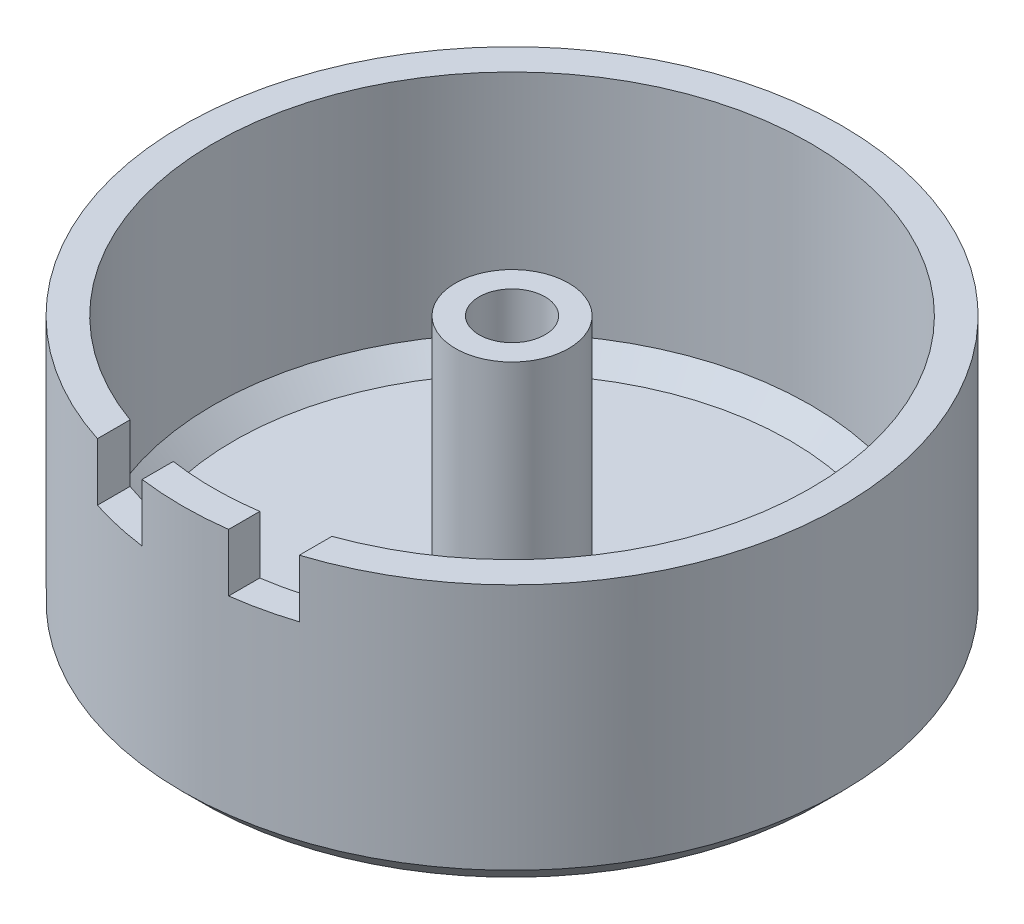
ISO-10303-21;
HEADER;
FILE_DESCRIPTION(('STEP AP214'),'2;1');
FILE_NAME('part.step','',(''),(''),'','','');
FILE_SCHEMA(('AUTOMOTIVE_DESIGN { 1 0 10303 214 1 1 1 1 }'));
ENDSEC;
DATA;
#1=APPLICATION_CONTEXT('core data for automotive mechanical design processes');
#2=APPLICATION_PROTOCOL_DEFINITION('international standard','automotive_design',2000,#1);
#3=PRODUCT_CONTEXT('',#1,'mechanical');
#4=PRODUCT('Part','Part','',(#3));
#5=PRODUCT_RELATED_PRODUCT_CATEGORY('part','',(#4));
#6=PRODUCT_DEFINITION_FORMATION('','',#4);
#7=PRODUCT_DEFINITION_CONTEXT('part definition',#1,'design');
#8=PRODUCT_DEFINITION('design','',#6,#7);
#9=PRODUCT_DEFINITION_SHAPE('','',#8);
#10=(LENGTH_UNIT() NAMED_UNIT(*) SI_UNIT(.MILLI.,.METRE.));
#11=(NAMED_UNIT(*) PLANE_ANGLE_UNIT() SI_UNIT($,.RADIAN.));
#12=(NAMED_UNIT(*) SI_UNIT($,.STERADIAN.) SOLID_ANGLE_UNIT());
#13=UNCERTAINTY_MEASURE_WITH_UNIT(LENGTH_MEASURE(1.E-05),#10,'distance_accuracy_value','');
#14=(GEOMETRIC_REPRESENTATION_CONTEXT(3) GLOBAL_UNCERTAINTY_ASSIGNED_CONTEXT((#13)) GLOBAL_UNIT_ASSIGNED_CONTEXT((#10,
#11,#12)) REPRESENTATION_CONTEXT('',''));
#15=CARTESIAN_POINT('',(0.,0.,0.));
#16=DIRECTION('',(0.,0.,1.));
#17=DIRECTION('',(1.,0.,0.));
#18=AXIS2_PLACEMENT_3D('',#15,#16,#17);
#19=CARTESIAN_POINT('',(-16.,6.25,0.));
#20=DIRECTION('',(0.,-1.,0.));
#21=DIRECTION('',(0.,0.,-1.));
#22=AXIS2_PLACEMENT_3D('',#19,#20,#21);
#23=PLANE('',#22);
#24=DIRECTION('',(0.,0.,-1.));
#25=VECTOR('',#24,1.);
#26=CARTESIAN_POINT('',(-4.9,6.25,20.));
#27=LINE('',#26,#25);
#28=CARTESIAN_POINT('',(-4.9,6.25,15.2312179421082));
#29=VERTEX_POINT('',#28);
#30=CARTESIAN_POINT('',(-4.9,6.25,13.6469776873856));
#31=VERTEX_POINT('',#30);
#32=EDGE_CURVE('E116',#29,#31,#27,.T.);
#33=ORIENTED_EDGE('',*,*,#32,.T.);
#34=CARTESIAN_POINT('',(0.,6.25,0.));
#35=DIRECTION('',(0.,-1.,0.));
#36=DIRECTION('',(0.,0.,-1.));
#37=AXIS2_PLACEMENT_3D('',#34,#35,#36);
#38=CIRCLE('',#37,14.5);
#39=CARTESIAN_POINT('',(4.9,6.25,13.6469776873856));
#40=VERTEX_POINT('',#39);
#41=EDGE_CURVE('E194',#31,#40,#38,.T.);
#42=ORIENTED_EDGE('',*,*,#41,.T.);
#43=DIRECTION('',(0.,0.,-1.));
#44=VECTOR('',#43,1.);
#45=CARTESIAN_POINT('',(4.9,6.25,20.));
#46=LINE('',#45,#44);
#47=CARTESIAN_POINT('',(4.9,6.25,15.2312179421082));
#48=VERTEX_POINT('',#47);
#49=EDGE_CURVE('E154',#48,#40,#46,.T.);
#50=ORIENTED_EDGE('',*,*,#49,.F.);
#51=CARTESIAN_POINT('',(0.,6.25,0.));
#52=DIRECTION('',(0.,-1.,0.));
#53=DIRECTION('',(0.,0.,-1.));
#54=AXIS2_PLACEMENT_3D('',#51,#52,#53);
#55=CIRCLE('',#54,16.);
#56=EDGE_CURVE('E122',#29,#48,#55,.T.);
#57=ORIENTED_EDGE('',*,*,#56,.F.);
#58=EDGE_LOOP('',(#33,#42,#50,#57));
#59=FACE_BOUND('',#58,.T.);
#60=ADVANCED_FACE('F37',(#59),#23,.F.);
#61=DIRECTION('',(0.,0.,-1.));
#62=VECTOR('',#61,1.);
#63=CARTESIAN_POINT('',(-2.1,6.25,20.));
#64=LINE('',#63,#62);
#65=CARTESIAN_POINT('',(-2.1,6.25,15.8615888233178));
#66=VERTEX_POINT('',#65);
#67=CARTESIAN_POINT('',(-2.1,6.25,14.3471251475688));
#68=VERTEX_POINT('',#67);
#69=EDGE_CURVE('E140',#66,#68,#64,.T.);
#70=ORIENTED_EDGE('',*,*,#69,.F.);
#71=CARTESIAN_POINT('',(2.1,6.25,15.8615888233178));
#72=VERTEX_POINT('',#71);
#73=EDGE_CURVE('E137',#72,#66,#55,.T.);
#74=ORIENTED_EDGE('',*,*,#73,.F.);
#75=DIRECTION('',(0.,0.,-1.));
#76=VECTOR('',#75,1.);
#77=CARTESIAN_POINT('',(2.1,6.25,20.));
#78=LINE('',#77,#76);
#79=CARTESIAN_POINT('',(2.1,6.25,14.3471251475688));
#80=VERTEX_POINT('',#79);
#81=EDGE_CURVE('E156',#72,#80,#78,.T.);
#82=ORIENTED_EDGE('',*,*,#81,.T.);
#83=EDGE_CURVE('E108',#80,#68,#38,.T.);
#84=ORIENTED_EDGE('',*,*,#83,.T.);
#85=EDGE_LOOP('',(#70,#74,#82,#84));
#86=FACE_BOUND('',#85,.T.);
#87=ADVANCED_FACE('F144',(#86),#23,.F.);
#88=CARTESIAN_POINT('',(0.,0.,0.));
#89=DIRECTION('',(0.,-1.,0.));
#90=DIRECTION('',(0.,0.,-1.));
#91=AXIS2_PLACEMENT_3D('',#88,#89,#90);
#92=CYLINDRICAL_SURFACE('',#91,14.5);
#93=CARTESIAN_POINT('',(0.,-4.75,0.));
#94=DIRECTION('',(0.,-1.,0.));
#95=DIRECTION('',(0.,0.,-1.));
#96=AXIS2_PLACEMENT_3D('',#93,#94,#95);
#97=CIRCLE('',#96,14.5);
#98=CARTESIAN_POINT('',(0.,-4.75,-14.5));
#99=VERTEX_POINT('',#98);
#100=EDGE_CURVE('E191',#99,#99,#97,.T.);
#101=ORIENTED_EDGE('',*,*,#100,.T.);
#102=EDGE_LOOP('',(#101));
#103=FACE_BOUND('',#102,.T.);
#104=DIRECTION('',(0.,-1.,0.));
#105=VECTOR('',#104,1.);
#106=CARTESIAN_POINT('',(-4.9,0.,13.6469776873856));
#107=LINE('',#106,#105);
#108=CARTESIAN_POINT('',(-4.9,3.45,13.6469776873856));
#109=VERTEX_POINT('',#108);
#110=EDGE_CURVE('E167',#109,#31,#107,.F.);
#111=ORIENTED_EDGE('',*,*,#110,.F.);
#112=CARTESIAN_POINT('',(0.,3.45,0.));
#113=DIRECTION('',(0.,1.,0.));
#114=DIRECTION('',(-1.,0.,0.));
#115=AXIS2_PLACEMENT_3D('',#112,#113,#114);
#116=CIRCLE('',#115,14.5);
#117=CARTESIAN_POINT('',(-2.1,3.45,14.3471251475688));
#118=VERTEX_POINT('',#117);
#119=EDGE_CURVE('E165',#118,#109,#116,.F.);
#120=ORIENTED_EDGE('',*,*,#119,.F.);
#121=DIRECTION('',(0.,-1.,0.));
#122=VECTOR('',#121,1.);
#123=CARTESIAN_POINT('',(-2.1,0.,14.3471251475688));
#124=LINE('',#123,#122);
#125=EDGE_CURVE('E163',#68,#118,#124,.T.);
#126=ORIENTED_EDGE('',*,*,#125,.F.);
#127=ORIENTED_EDGE('',*,*,#83,.F.);
#128=DIRECTION('',(0.,-1.,0.));
#129=VECTOR('',#128,1.);
#130=CARTESIAN_POINT('',(2.1,0.,14.3471251475688));
#131=LINE('',#130,#129);
#132=CARTESIAN_POINT('',(2.1,3.45,14.3471251475688));
#133=VERTEX_POINT('',#132);
#134=EDGE_CURVE('E160',#133,#80,#131,.F.);
#135=ORIENTED_EDGE('',*,*,#134,.F.);
#136=CARTESIAN_POINT('',(0.,3.45,0.));
#137=DIRECTION('',(0.,1.,0.));
#138=DIRECTION('',(-1.,0.,0.));
#139=AXIS2_PLACEMENT_3D('',#136,#137,#138);
#140=CIRCLE('',#139,14.5);
#141=CARTESIAN_POINT('',(4.9,3.45,13.6469776873856));
#142=VERTEX_POINT('',#141);
#143=EDGE_CURVE('E153',#142,#133,#140,.F.);
#144=ORIENTED_EDGE('',*,*,#143,.F.);
#145=DIRECTION('',(0.,-1.,0.));
#146=VECTOR('',#145,1.);
#147=CARTESIAN_POINT('',(4.9,0.,13.6469776873856));
#148=LINE('',#147,#146);
#149=EDGE_CURVE('E115',#40,#142,#148,.T.);
#150=ORIENTED_EDGE('',*,*,#149,.F.);
#151=ORIENTED_EDGE('',*,*,#41,.F.);
#152=EDGE_LOOP('',(#111,#120,#126,#127,#135,#144,#150,#151));
#153=FACE_BOUND('',#152,.T.);
#154=ADVANCED_FACE('F200',(#103,#153),#92,.F.);
#155=CARTESIAN_POINT('',(0.,0.,0.));
#156=DIRECTION('',(0.,-1.,0.));
#157=DIRECTION('',(0.,0.,-1.));
#158=AXIS2_PLACEMENT_3D('',#155,#156,#157);
#159=CYLINDRICAL_SURFACE('',#158,16.);
#160=CARTESIAN_POINT('',(0.,-5.75297943852697,0.));
#161=DIRECTION('',(0.,-1.,0.));
#162=DIRECTION('',(0.,0.,-1.));
#163=AXIS2_PLACEMENT_3D('',#160,#161,#162);
#164=CIRCLE('',#163,16.);
#165=CARTESIAN_POINT('',(0.,-5.75297943852697,-16.));
#166=VERTEX_POINT('',#165);
#167=EDGE_CURVE('E170',#166,#166,#164,.T.);
#168=ORIENTED_EDGE('',*,*,#167,.F.);
#169=EDGE_LOOP('',(#168));
#170=FACE_BOUND('',#169,.T.);
#171=DIRECTION('',(0.,-1.,0.));
#172=VECTOR('',#171,1.);
#173=CARTESIAN_POINT('',(-4.9,0.,15.2312179421082));
#174=LINE('',#173,#172);
#175=CARTESIAN_POINT('',(-4.9,3.45,15.2312179421082));
#176=VERTEX_POINT('',#175);
#177=EDGE_CURVE('E11',#29,#176,#174,.T.);
#178=ORIENTED_EDGE('',*,*,#177,.F.);
#179=ORIENTED_EDGE('',*,*,#56,.T.);
#180=DIRECTION('',(0.,-1.,0.));
#181=VECTOR('',#180,1.);
#182=CARTESIAN_POINT('',(4.9,0.,15.2312179421082));
#183=LINE('',#182,#181);
#184=CARTESIAN_POINT('',(4.9,3.45,15.2312179421082));
#185=VERTEX_POINT('',#184);
#186=EDGE_CURVE('E112',#185,#48,#183,.F.);
#187=ORIENTED_EDGE('',*,*,#186,.F.);
#188=CARTESIAN_POINT('',(0.,3.45,0.));
#189=DIRECTION('',(0.,1.,0.));
#190=DIRECTION('',(-1.,0.,0.));
#191=AXIS2_PLACEMENT_3D('',#188,#189,#190);
#192=CIRCLE('',#191,16.);
#193=CARTESIAN_POINT('',(2.1,3.45,15.8615888233178));
#194=VERTEX_POINT('',#193);
#195=EDGE_CURVE('E99',#194,#185,#192,.T.);
#196=ORIENTED_EDGE('',*,*,#195,.F.);
#197=DIRECTION('',(0.,-1.,0.));
#198=VECTOR('',#197,1.);
#199=CARTESIAN_POINT('',(2.1,0.,15.8615888233178));
#200=LINE('',#199,#198);
#201=EDGE_CURVE('E107',#72,#194,#200,.T.);
#202=ORIENTED_EDGE('',*,*,#201,.F.);
#203=ORIENTED_EDGE('',*,*,#73,.T.);
#204=DIRECTION('',(0.,-1.,0.));
#205=VECTOR('',#204,1.);
#206=CARTESIAN_POINT('',(-2.1,0.,15.8615888233178));
#207=LINE('',#206,#205);
#208=CARTESIAN_POINT('',(-2.1,3.45,15.8615888233178));
#209=VERTEX_POINT('',#208);
#210=EDGE_CURVE('E123',#209,#66,#207,.F.);
#211=ORIENTED_EDGE('',*,*,#210,.F.);
#212=CARTESIAN_POINT('',(0.,3.45,0.));
#213=DIRECTION('',(0.,1.,0.));
#214=DIRECTION('',(-1.,0.,0.));
#215=AXIS2_PLACEMENT_3D('',#212,#213,#214);
#216=CIRCLE('',#215,16.);
#217=EDGE_CURVE('E44',#176,#209,#216,.T.);
#218=ORIENTED_EDGE('',*,*,#217,.F.);
#219=EDGE_LOOP('',(#178,#179,#187,#196,#202,#203,#211,#218));
#220=FACE_BOUND('',#219,.T.);
#221=ADVANCED_FACE('F120',(#170,#220),#159,.T.);
#222=CARTESIAN_POINT('',(0.,-5.75,0.));
#223=DIRECTION('',(0.,1.,0.));
#224=DIRECTION('',(0.,0.,1.));
#225=AXIS2_PLACEMENT_3D('',#222,#223,#224);
#226=CONICAL_SURFACE('',#225,13.5,0.785398163397447);
#227=ORIENTED_EDGE('',*,*,#100,.F.);
#228=EDGE_LOOP('',(#227));
#229=FACE_BOUND('',#228,.T.);
#230=CARTESIAN_POINT('',(0.,-5.75,0.));
#231=DIRECTION('',(0.,-1.,0.));
#232=DIRECTION('',(0.,0.,-1.));
#233=AXIS2_PLACEMENT_3D('',#230,#231,#232);
#234=CIRCLE('',#233,13.5);
#235=CARTESIAN_POINT('',(0.,-5.75,-13.5));
#236=VERTEX_POINT('',#235);
#237=EDGE_CURVE('E188',#236,#236,#234,.T.);
#238=ORIENTED_EDGE('',*,*,#237,.T.);
#239=EDGE_LOOP('',(#238));
#240=FACE_BOUND('',#239,.T.);
#241=ADVANCED_FACE('F226',(#229,#240),#226,.F.);
#242=CARTESIAN_POINT('',(-13.5,-5.75,0.));
#243=DIRECTION('',(0.,-1.,0.));
#244=DIRECTION('',(0.,0.,-1.));
#245=AXIS2_PLACEMENT_3D('',#242,#243,#244);
#246=PLANE('',#245);
#247=ORIENTED_EDGE('',*,*,#237,.F.);
#248=EDGE_LOOP('',(#247));
#249=FACE_BOUND('',#248,.T.);
#250=CARTESIAN_POINT('',(0.,-5.75,0.));
#251=DIRECTION('',(0.,-1.,0.));
#252=DIRECTION('',(0.,0.,-1.));
#253=AXIS2_PLACEMENT_3D('',#250,#251,#252);
#254=CIRCLE('',#253,2.75);
#255=CARTESIAN_POINT('',(0.,-5.75,-2.75));
#256=VERTEX_POINT('',#255);
#257=EDGE_CURVE('E185',#256,#256,#254,.T.);
#258=ORIENTED_EDGE('',*,*,#257,.T.);
#259=EDGE_LOOP('',(#258));
#260=FACE_BOUND('',#259,.T.);
#261=ADVANCED_FACE('F232',(#249,#260),#246,.F.);
#262=CARTESIAN_POINT('',(0.,0.,0.));
#263=DIRECTION('',(0.,-1.,0.));
#264=DIRECTION('',(0.,0.,-1.));
#265=AXIS2_PLACEMENT_3D('',#262,#263,#264);
#266=CYLINDRICAL_SURFACE('',#265,2.75);
#267=ORIENTED_EDGE('',*,*,#257,.F.);
#268=EDGE_LOOP('',(#267));
#269=FACE_BOUND('',#268,.T.);
#270=CARTESIAN_POINT('',(0.,6.25,0.));
#271=DIRECTION('',(0.,-1.,0.));
#272=DIRECTION('',(0.,0.,-1.));
#273=AXIS2_PLACEMENT_3D('',#270,#271,#272);
#274=CIRCLE('',#273,2.75);
#275=CARTESIAN_POINT('',(0.,6.25,-2.75));
#276=VERTEX_POINT('',#275);
#277=EDGE_CURVE('E182',#276,#276,#274,.T.);
#278=ORIENTED_EDGE('',*,*,#277,.T.);
#279=EDGE_LOOP('',(#278));
#280=FACE_BOUND('',#279,.T.);
#281=ADVANCED_FACE('F236',(#269,#280),#266,.T.);
#282=CARTESIAN_POINT('',(-2.75,6.25,0.));
#283=DIRECTION('',(0.,-1.,0.));
#284=DIRECTION('',(0.,0.,-1.));
#285=AXIS2_PLACEMENT_3D('',#282,#283,#284);
#286=PLANE('',#285);
#287=ORIENTED_EDGE('',*,*,#277,.F.);
#288=EDGE_LOOP('',(#287));
#289=FACE_BOUND('',#288,.T.);
#290=CARTESIAN_POINT('',(0.,6.25,0.));
#291=DIRECTION('',(0.,-1.,0.));
#292=DIRECTION('',(0.,0.,-1.));
#293=AXIS2_PLACEMENT_3D('',#290,#291,#292);
#294=CIRCLE('',#293,1.6);
#295=CARTESIAN_POINT('',(0.,6.25,-1.6));
#296=VERTEX_POINT('',#295);
#297=EDGE_CURVE('E179',#296,#296,#294,.T.);
#298=ORIENTED_EDGE('',*,*,#297,.T.);
#299=EDGE_LOOP('',(#298));
#300=FACE_BOUND('',#299,.T.);
#301=ADVANCED_FACE('F240',(#289,#300),#286,.F.);
#302=CARTESIAN_POINT('',(0.,0.,0.));
#303=DIRECTION('',(0.,-1.,0.));
#304=DIRECTION('',(0.,0.,-1.));
#305=AXIS2_PLACEMENT_3D('',#302,#303,#304);
#306=CYLINDRICAL_SURFACE('',#305,1.6);
#307=ORIENTED_EDGE('',*,*,#297,.F.);
#308=EDGE_LOOP('',(#307));
#309=FACE_BOUND('',#308,.T.);
#310=CARTESIAN_POINT('',(0.,-6.75,0.));
#311=DIRECTION('',(0.,-1.,0.));
#312=DIRECTION('',(0.,0.,-1.));
#313=AXIS2_PLACEMENT_3D('',#310,#311,#312);
#314=CIRCLE('',#313,1.6);
#315=CARTESIAN_POINT('',(0.,-6.75,-1.6));
#316=VERTEX_POINT('',#315);
#317=EDGE_CURVE('E176',#316,#316,#314,.T.);
#318=ORIENTED_EDGE('',*,*,#317,.T.);
#319=EDGE_LOOP('',(#318));
#320=FACE_BOUND('',#319,.T.);
#321=ADVANCED_FACE('F244',(#309,#320),#306,.F.);
#322=CARTESIAN_POINT('',(-1.6,-6.75,0.));
#323=DIRECTION('',(0.,1.,0.));
#324=DIRECTION('',(0.,0.,1.));
#325=AXIS2_PLACEMENT_3D('',#322,#323,#324);
#326=PLANE('',#325);
#327=ORIENTED_EDGE('',*,*,#317,.F.);
#328=EDGE_LOOP('',(#327));
#329=FACE_BOUND('',#328,.T.);
#330=CARTESIAN_POINT('',(0.,-6.75,0.));
#331=DIRECTION('',(0.,-1.,0.));
#332=DIRECTION('',(0.,0.,-1.));
#333=AXIS2_PLACEMENT_3D('',#330,#331,#332);
#334=CIRCLE('',#333,15.002979438527);
#335=CARTESIAN_POINT('',(0.,-6.75,-15.002979438527));
#336=VERTEX_POINT('',#335);
#337=EDGE_CURVE('E173',#336,#336,#334,.T.);
#338=ORIENTED_EDGE('',*,*,#337,.T.);
#339=EDGE_LOOP('',(#338));
#340=FACE_BOUND('',#339,.T.);
#341=ADVANCED_FACE('F248',(#329,#340),#326,.F.);
#342=CARTESIAN_POINT('',(0.,-5.75297943852697,0.));
#343=DIRECTION('',(0.,1.,0.));
#344=DIRECTION('',(0.,0.,1.));
#345=AXIS2_PLACEMENT_3D('',#342,#343,#344);
#346=CONICAL_SURFACE('',#345,16.,0.785398163397447);
#347=ORIENTED_EDGE('',*,*,#337,.F.);
#348=EDGE_LOOP('',(#347));
#349=FACE_BOUND('',#348,.T.);
#350=ORIENTED_EDGE('',*,*,#167,.T.);
#351=EDGE_LOOP('',(#350));
#352=FACE_BOUND('',#351,.T.);
#353=ADVANCED_FACE('F252',(#349,#352),#346,.T.);
#354=CARTESIAN_POINT('',(4.9,6.25,20.));
#355=DIRECTION('',(-1.,0.,0.));
#356=DIRECTION('',(0.,-1.,0.));
#357=AXIS2_PLACEMENT_3D('',#354,#355,#356);
#358=PLANE('',#357);
#359=ORIENTED_EDGE('',*,*,#149,.T.);
#360=DIRECTION('',(0.,0.,-1.));
#361=VECTOR('',#360,1.);
#362=CARTESIAN_POINT('',(4.9,3.45,20.));
#363=LINE('',#362,#361);
#364=EDGE_CURVE('E102',#185,#142,#363,.T.);
#365=ORIENTED_EDGE('',*,*,#364,.F.);
#366=ORIENTED_EDGE('',*,*,#186,.T.);
#367=ORIENTED_EDGE('',*,*,#49,.T.);
#368=EDGE_LOOP('',(#359,#365,#366,#367));
#369=FACE_BOUND('',#368,.T.);
#370=ADVANCED_FACE('F111',(#369),#358,.T.);
#371=CARTESIAN_POINT('',(2.1,6.25,20.));
#372=DIRECTION('',(1.,0.,0.));
#373=DIRECTION('',(0.,0.,-1.));
#374=AXIS2_PLACEMENT_3D('',#371,#372,#373);
#375=PLANE('',#374);
#376=ORIENTED_EDGE('',*,*,#134,.T.);
#377=ORIENTED_EDGE('',*,*,#81,.F.);
#378=ORIENTED_EDGE('',*,*,#201,.T.);
#379=DIRECTION('',(0.,0.,-1.));
#380=VECTOR('',#379,1.);
#381=CARTESIAN_POINT('',(2.1,3.45,20.));
#382=LINE('',#381,#380);
#383=EDGE_CURVE('E59',#194,#133,#382,.T.);
#384=ORIENTED_EDGE('',*,*,#383,.T.);
#385=EDGE_LOOP('',(#376,#377,#378,#384));
#386=FACE_BOUND('',#385,.T.);
#387=ADVANCED_FACE('F203',(#386),#375,.T.);
#388=CARTESIAN_POINT('',(4.9,3.45,20.));
#389=DIRECTION('',(0.,1.,0.));
#390=DIRECTION('',(-1.,0.,0.));
#391=AXIS2_PLACEMENT_3D('',#388,#389,#390);
#392=PLANE('',#391);
#393=ORIENTED_EDGE('',*,*,#143,.T.);
#394=ORIENTED_EDGE('',*,*,#383,.F.);
#395=ORIENTED_EDGE('',*,*,#195,.T.);
#396=ORIENTED_EDGE('',*,*,#364,.T.);
#397=EDGE_LOOP('',(#393,#394,#395,#396));
#398=FACE_BOUND('',#397,.T.);
#399=ADVANCED_FACE('F101',(#398),#392,.T.);
#400=CARTESIAN_POINT('',(-4.9,6.25,20.));
#401=DIRECTION('',(1.,0.,0.));
#402=DIRECTION('',(0.,1.,0.));
#403=AXIS2_PLACEMENT_3D('',#400,#401,#402);
#404=PLANE('',#403);
#405=ORIENTED_EDGE('',*,*,#110,.T.);
#406=ORIENTED_EDGE('',*,*,#32,.F.);
#407=ORIENTED_EDGE('',*,*,#177,.T.);
#408=DIRECTION('',(0.,0.,-1.));
#409=VECTOR('',#408,1.);
#410=CARTESIAN_POINT('',(-4.9,3.45,20.));
#411=LINE('',#410,#409);
#412=EDGE_CURVE('E134',#176,#109,#411,.T.);
#413=ORIENTED_EDGE('',*,*,#412,.T.);
#414=EDGE_LOOP('',(#405,#406,#407,#413));
#415=FACE_BOUND('',#414,.T.);
#416=ADVANCED_FACE('F205',(#415),#404,.T.);
#417=CARTESIAN_POINT('',(-4.9,3.45,20.));
#418=DIRECTION('',(0.,1.,0.));
#419=DIRECTION('',(-1.,0.,0.));
#420=AXIS2_PLACEMENT_3D('',#417,#418,#419);
#421=PLANE('',#420);
#422=ORIENTED_EDGE('',*,*,#119,.T.);
#423=ORIENTED_EDGE('',*,*,#412,.F.);
#424=ORIENTED_EDGE('',*,*,#217,.T.);
#425=DIRECTION('',(0.,0.,-1.));
#426=VECTOR('',#425,1.);
#427=CARTESIAN_POINT('',(-2.1,3.45,20.));
#428=LINE('',#427,#426);
#429=EDGE_CURVE('E51',#209,#118,#428,.T.);
#430=ORIENTED_EDGE('',*,*,#429,.T.);
#431=EDGE_LOOP('',(#422,#423,#424,#430));
#432=FACE_BOUND('',#431,.T.);
#433=ADVANCED_FACE('F131',(#432),#421,.T.);
#434=CARTESIAN_POINT('',(-2.1,6.25,20.));
#435=DIRECTION('',(-1.,0.,0.));
#436=DIRECTION('',(0.,0.,1.));
#437=AXIS2_PLACEMENT_3D('',#434,#435,#436);
#438=PLANE('',#437);
#439=ORIENTED_EDGE('',*,*,#125,.T.);
#440=ORIENTED_EDGE('',*,*,#429,.F.);
#441=ORIENTED_EDGE('',*,*,#210,.T.);
#442=ORIENTED_EDGE('',*,*,#69,.T.);
#443=EDGE_LOOP('',(#439,#440,#441,#442));
#444=FACE_BOUND('',#443,.T.);
#445=ADVANCED_FACE('F139',(#444),#438,.T.);
#446=CLOSED_SHELL('',(#60,#87,#154,#221,#241,#261,#281,#301,#321,#341,#353,#370,#387,#399,#416,
#433,#445));
#447=MANIFOLD_SOLID_BREP('B2',#446);
#448=ADVANCED_BREP_SHAPE_REPRESENTATION('',(#18,#447),#14);
#449=SHAPE_DEFINITION_REPRESENTATION(#9,#448);
ENDSEC;
END-ISO-10303-21;
